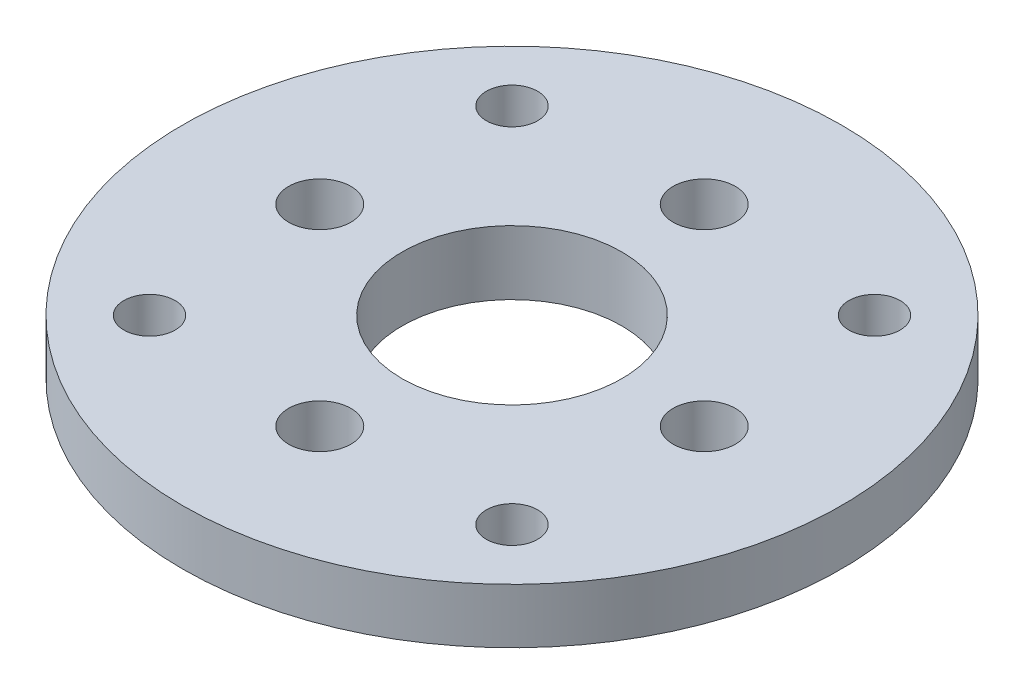
ISO-10303-21;
HEADER;
FILE_DESCRIPTION(('STEP AP214'),'2;1');
FILE_NAME('part.step','',(''),(''),'','','');
FILE_SCHEMA(('AUTOMOTIVE_DESIGN { 1 0 10303 214 1 1 1 1 }'));
ENDSEC;
DATA;
#1=APPLICATION_CONTEXT('core data for automotive mechanical design processes');
#2=APPLICATION_PROTOCOL_DEFINITION('international standard','automotive_design',2000,#1);
#3=PRODUCT_CONTEXT('',#1,'mechanical');
#4=PRODUCT('Part','Part','',(#3));
#5=PRODUCT_RELATED_PRODUCT_CATEGORY('part','',(#4));
#6=PRODUCT_DEFINITION_FORMATION('','',#4);
#7=PRODUCT_DEFINITION_CONTEXT('part definition',#1,'design');
#8=PRODUCT_DEFINITION('design','',#6,#7);
#9=PRODUCT_DEFINITION_SHAPE('','',#8);
#10=(LENGTH_UNIT() NAMED_UNIT(*) SI_UNIT(.MILLI.,.METRE.));
#11=(NAMED_UNIT(*) PLANE_ANGLE_UNIT() SI_UNIT($,.RADIAN.));
#12=(NAMED_UNIT(*) SI_UNIT($,.STERADIAN.) SOLID_ANGLE_UNIT());
#13=UNCERTAINTY_MEASURE_WITH_UNIT(LENGTH_MEASURE(1.E-05),#10,'distance_accuracy_value','');
#14=(GEOMETRIC_REPRESENTATION_CONTEXT(3) GLOBAL_UNCERTAINTY_ASSIGNED_CONTEXT((#13)) GLOBAL_UNIT_ASSIGNED_CONTEXT((#10,
#11,#12)) REPRESENTATION_CONTEXT('',''));
#15=CARTESIAN_POINT('',(0.,0.,0.));
#16=DIRECTION('',(0.,0.,1.));
#17=DIRECTION('',(1.,0.,0.));
#18=AXIS2_PLACEMENT_3D('',#15,#16,#17);
#19=CARTESIAN_POINT('',(0.,0.5,0.));
#20=DIRECTION('',(0.,-1.,0.));
#21=DIRECTION('',(0.,0.,-1.));
#22=AXIS2_PLACEMENT_3D('',#19,#20,#21);
#23=CYLINDRICAL_SURFACE('',#22,16.5);
#24=CARTESIAN_POINT('',(0.,0.5,0.));
#25=DIRECTION('',(0.,1.,0.));
#26=DIRECTION('',(0.,0.,1.));
#27=AXIS2_PLACEMENT_3D('',#24,#25,#26);
#28=CIRCLE('',#27,16.5);
#29=CARTESIAN_POINT('',(0.,0.5,16.5));
#30=VERTEX_POINT('',#29);
#31=EDGE_CURVE('E10',#30,#30,#28,.T.);
#32=ORIENTED_EDGE('',*,*,#31,.F.);
#33=EDGE_LOOP('',(#32));
#34=FACE_BOUND('',#33,.T.);
#35=CARTESIAN_POINT('',(0.,0.,0.));
#36=DIRECTION('',(0.,1.,0.));
#37=DIRECTION('',(0.,0.,1.));
#38=AXIS2_PLACEMENT_3D('',#35,#36,#37);
#39=CIRCLE('',#38,16.5);
#40=CARTESIAN_POINT('',(0.,0.,16.5));
#41=VERTEX_POINT('',#40);
#42=EDGE_CURVE('E39',#41,#41,#39,.T.);
#43=ORIENTED_EDGE('',*,*,#42,.T.);
#44=EDGE_LOOP('',(#43));
#45=FACE_BOUND('',#44,.T.);
#46=ADVANCED_FACE('F38',(#34,#45),#23,.T.);
#47=CARTESIAN_POINT('',(0.,0.,0.));
#48=DIRECTION('',(0.,1.,0.));
#49=DIRECTION('',(0.,0.,1.));
#50=AXIS2_PLACEMENT_3D('',#47,#48,#49);
#51=PLANE('',#50);
#52=CARTESIAN_POINT('',(9.89949493661165,0.,9.89949493661168));
#53=DIRECTION('',(0.,1.,0.));
#54=DIRECTION('',(-1.,0.,0.));
#55=AXIS2_PLACEMENT_3D('',#52,#53,#54);
#56=CIRCLE('',#55,1.4);
#57=CARTESIAN_POINT('',(8.49949493661165,0.,9.89949493661168));
#58=VERTEX_POINT('',#57);
#59=EDGE_CURVE('E105',#58,#58,#56,.T.);
#60=ORIENTED_EDGE('',*,*,#59,.T.);
#61=EDGE_LOOP('',(#60));
#62=FACE_BOUND('',#61,.T.);
#63=CARTESIAN_POINT('',(-9.89949493661165,0.,9.89949493661168));
#64=DIRECTION('',(0.,1.,0.));
#65=DIRECTION('',(0.,0.,-1.));
#66=AXIS2_PLACEMENT_3D('',#63,#64,#65);
#67=CIRCLE('',#66,1.4);
#68=CARTESIAN_POINT('',(-9.89949493661165,0.,8.49949493661168));
#69=VERTEX_POINT('',#68);
#70=EDGE_CURVE('E96',#69,#69,#67,.T.);
#71=ORIENTED_EDGE('',*,*,#70,.T.);
#72=EDGE_LOOP('',(#71));
#73=FACE_BOUND('',#72,.T.);
#74=CARTESIAN_POINT('',(-9.89949493661158,0.,-9.89949493661175));
#75=DIRECTION('',(0.,1.,0.));
#76=DIRECTION('',(1.,0.,0.));
#77=AXIS2_PLACEMENT_3D('',#74,#75,#76);
#78=CIRCLE('',#77,1.4);
#79=CARTESIAN_POINT('',(-8.49949493661158,0.,-9.89949493661174));
#80=VERTEX_POINT('',#79);
#81=EDGE_CURVE('E89',#80,#80,#78,.T.);
#82=ORIENTED_EDGE('',*,*,#81,.T.);
#83=EDGE_LOOP('',(#82));
#84=FACE_BOUND('',#83,.T.);
#85=CARTESIAN_POINT('',(9.89949493661165,0.,-9.89949493661168));
#86=DIRECTION('',(0.,1.,0.));
#87=DIRECTION('',(0.,0.,1.));
#88=AXIS2_PLACEMENT_3D('',#85,#86,#87);
#89=CIRCLE('',#88,1.4);
#90=CARTESIAN_POINT('',(9.89949493661165,0.,-8.49949493661168));
#91=VERTEX_POINT('',#90);
#92=EDGE_CURVE('E83',#91,#91,#89,.T.);
#93=ORIENTED_EDGE('',*,*,#92,.T.);
#94=EDGE_LOOP('',(#93));
#95=FACE_BOUND('',#94,.T.);
#96=CARTESIAN_POINT('',(0.,0.,10.5));
#97=DIRECTION('',(0.,1.,0.));
#98=DIRECTION('',(-1.,0.,0.));
#99=AXIS2_PLACEMENT_3D('',#96,#97,#98);
#100=CIRCLE('',#99,1.7);
#101=CARTESIAN_POINT('',(-1.70000000000004,0.,10.5));
#102=VERTEX_POINT('',#101);
#103=EDGE_CURVE('E78',#102,#102,#100,.T.);
#104=ORIENTED_EDGE('',*,*,#103,.T.);
#105=EDGE_LOOP('',(#104));
#106=FACE_BOUND('',#105,.T.);
#107=CARTESIAN_POINT('',(-10.5,0.,0.));
#108=DIRECTION('',(0.,1.,0.));
#109=DIRECTION('',(0.,0.,-1.));
#110=AXIS2_PLACEMENT_3D('',#107,#108,#109);
#111=CIRCLE('',#110,1.7);
#112=CARTESIAN_POINT('',(-10.5,0.,-1.7));
#113=VERTEX_POINT('',#112);
#114=EDGE_CURVE('E71',#113,#113,#111,.T.);
#115=ORIENTED_EDGE('',*,*,#114,.T.);
#116=EDGE_LOOP('',(#115));
#117=FACE_BOUND('',#116,.T.);
#118=CARTESIAN_POINT('',(1.09981662173559E-13,0.,-10.5));
#119=DIRECTION('',(0.,1.,0.));
#120=DIRECTION('',(1.,0.,0.));
#121=AXIS2_PLACEMENT_3D('',#118,#119,#120);
#122=CIRCLE('',#121,1.7);
#123=CARTESIAN_POINT('',(1.70000000000011,0.,-10.5));
#124=VERTEX_POINT('',#123);
#125=EDGE_CURVE('E68',#124,#124,#122,.T.);
#126=ORIENTED_EDGE('',*,*,#125,.T.);
#127=EDGE_LOOP('',(#126));
#128=FACE_BOUND('',#127,.T.);
#129=CARTESIAN_POINT('',(10.5,0.,0.));
#130=DIRECTION('',(0.,1.,0.));
#131=DIRECTION('',(0.,0.,1.));
#132=AXIS2_PLACEMENT_3D('',#129,#130,#131);
#133=CIRCLE('',#132,1.7);
#134=CARTESIAN_POINT('',(10.5,0.,1.7));
#135=VERTEX_POINT('',#134);
#136=EDGE_CURVE('E58',#135,#135,#133,.T.);
#137=ORIENTED_EDGE('',*,*,#136,.T.);
#138=EDGE_LOOP('',(#137));
#139=FACE_BOUND('',#138,.T.);
#140=CARTESIAN_POINT('',(0.,0.,0.));
#141=DIRECTION('',(0.,1.,0.));
#142=DIRECTION('',(0.,0.,1.));
#143=AXIS2_PLACEMENT_3D('',#140,#141,#142);
#144=CIRCLE('',#143,6.);
#145=CARTESIAN_POINT('',(0.,0.,6.));
#146=VERTEX_POINT('',#145);
#147=EDGE_CURVE('E53',#146,#146,#144,.T.);
#148=ORIENTED_EDGE('',*,*,#147,.T.);
#149=EDGE_LOOP('',(#148));
#150=FACE_BOUND('',#149,.T.);
#151=ORIENTED_EDGE('',*,*,#42,.F.);
#152=EDGE_LOOP('',(#151));
#153=FACE_BOUND('',#152,.T.);
#154=ADVANCED_FACE('F140',(#62,#73,#84,#95,#106,#117,#128,#139,#150,#153),#51,.F.);
#155=CARTESIAN_POINT('',(0.,3.5,0.));
#156=DIRECTION('',(0.,-1.,0.));
#157=DIRECTION('',(0.,0.,-1.));
#158=AXIS2_PLACEMENT_3D('',#155,#156,#157);
#159=CYLINDRICAL_SURFACE('',#158,18.);
#160=CARTESIAN_POINT('',(0.,3.5,0.));
#161=DIRECTION('',(0.,1.,0.));
#162=DIRECTION('',(0.,0.,1.));
#163=AXIS2_PLACEMENT_3D('',#160,#161,#162);
#164=CIRCLE('',#163,18.);
#165=CARTESIAN_POINT('',(0.,3.5,18.));
#166=VERTEX_POINT('',#165);
#167=EDGE_CURVE('E46',#166,#166,#164,.T.);
#168=ORIENTED_EDGE('',*,*,#167,.F.);
#169=EDGE_LOOP('',(#168));
#170=FACE_BOUND('',#169,.T.);
#171=CARTESIAN_POINT('',(0.,0.5,0.));
#172=DIRECTION('',(0.,1.,0.));
#173=DIRECTION('',(0.,0.,1.));
#174=AXIS2_PLACEMENT_3D('',#171,#172,#173);
#175=CIRCLE('',#174,18.);
#176=CARTESIAN_POINT('',(0.,0.5,18.));
#177=VERTEX_POINT('',#176);
#178=EDGE_CURVE('E48',#177,#177,#175,.T.);
#179=ORIENTED_EDGE('',*,*,#178,.T.);
#180=EDGE_LOOP('',(#179));
#181=FACE_BOUND('',#180,.T.);
#182=ADVANCED_FACE('F113',(#170,#181),#159,.T.);
#183=CARTESIAN_POINT('',(0.,3.5,0.));
#184=DIRECTION('',(0.,1.,0.));
#185=DIRECTION('',(0.,0.,1.));
#186=AXIS2_PLACEMENT_3D('',#183,#184,#185);
#187=PLANE('',#186);
#188=CARTESIAN_POINT('',(9.89949493661165,3.5,9.89949493661168));
#189=DIRECTION('',(0.,1.,0.));
#190=DIRECTION('',(-1.,0.,0.));
#191=AXIS2_PLACEMENT_3D('',#188,#189,#190);
#192=CIRCLE('',#191,1.4);
#193=CARTESIAN_POINT('',(8.49949493661165,3.5,9.89949493661168));
#194=VERTEX_POINT('',#193);
#195=EDGE_CURVE('E87',#194,#194,#192,.T.);
#196=ORIENTED_EDGE('',*,*,#195,.F.);
#197=EDGE_LOOP('',(#196));
#198=FACE_BOUND('',#197,.T.);
#199=CARTESIAN_POINT('',(-9.89949493661165,3.5,9.89949493661168));
#200=DIRECTION('',(0.,1.,0.));
#201=DIRECTION('',(0.,0.,-1.));
#202=AXIS2_PLACEMENT_3D('',#199,#200,#201);
#203=CIRCLE('',#202,1.4);
#204=CARTESIAN_POINT('',(-9.89949493661165,3.5,8.49949493661168));
#205=VERTEX_POINT('',#204);
#206=EDGE_CURVE('E97',#205,#205,#203,.T.);
#207=ORIENTED_EDGE('',*,*,#206,.F.);
#208=EDGE_LOOP('',(#207));
#209=FACE_BOUND('',#208,.T.);
#210=CARTESIAN_POINT('',(-9.89949493661158,3.5,-9.89949493661175));
#211=DIRECTION('',(0.,1.,0.));
#212=DIRECTION('',(1.,0.,0.));
#213=AXIS2_PLACEMENT_3D('',#210,#211,#212);
#214=CIRCLE('',#213,1.4);
#215=CARTESIAN_POINT('',(-8.49949493661158,3.5,-9.89949493661174));
#216=VERTEX_POINT('',#215);
#217=EDGE_CURVE('E91',#216,#216,#214,.T.);
#218=ORIENTED_EDGE('',*,*,#217,.F.);
#219=EDGE_LOOP('',(#218));
#220=FACE_BOUND('',#219,.T.);
#221=CARTESIAN_POINT('',(9.89949493661165,3.5,-9.89949493661168));
#222=DIRECTION('',(0.,1.,0.));
#223=DIRECTION('',(0.,0.,1.));
#224=AXIS2_PLACEMENT_3D('',#221,#222,#223);
#225=CIRCLE('',#224,1.4);
#226=CARTESIAN_POINT('',(9.89949493661165,3.5,-8.49949493661168));
#227=VERTEX_POINT('',#226);
#228=EDGE_CURVE('E66',#227,#227,#225,.T.);
#229=ORIENTED_EDGE('',*,*,#228,.F.);
#230=EDGE_LOOP('',(#229));
#231=FACE_BOUND('',#230,.T.);
#232=CARTESIAN_POINT('',(0.,3.5,10.5));
#233=DIRECTION('',(0.,1.,0.));
#234=DIRECTION('',(-1.,0.,0.));
#235=AXIS2_PLACEMENT_3D('',#232,#233,#234);
#236=CIRCLE('',#235,1.7);
#237=CARTESIAN_POINT('',(-1.70000000000004,3.5,10.5));
#238=VERTEX_POINT('',#237);
#239=EDGE_CURVE('E65',#238,#238,#236,.T.);
#240=ORIENTED_EDGE('',*,*,#239,.F.);
#241=EDGE_LOOP('',(#240));
#242=FACE_BOUND('',#241,.T.);
#243=CARTESIAN_POINT('',(-10.5,3.5,0.));
#244=DIRECTION('',(0.,1.,0.));
#245=DIRECTION('',(0.,0.,-1.));
#246=AXIS2_PLACEMENT_3D('',#243,#244,#245);
#247=CIRCLE('',#246,1.7);
#248=CARTESIAN_POINT('',(-10.5,3.5,-1.7));
#249=VERTEX_POINT('',#248);
#250=EDGE_CURVE('E79',#249,#249,#247,.T.);
#251=ORIENTED_EDGE('',*,*,#250,.F.);
#252=EDGE_LOOP('',(#251));
#253=FACE_BOUND('',#252,.T.);
#254=CARTESIAN_POINT('',(1.09981662173559E-13,3.5,-10.5));
#255=DIRECTION('',(0.,1.,0.));
#256=DIRECTION('',(1.,0.,0.));
#257=AXIS2_PLACEMENT_3D('',#254,#255,#256);
#258=CIRCLE('',#257,1.7);
#259=CARTESIAN_POINT('',(1.70000000000011,3.5,-10.5));
#260=VERTEX_POINT('',#259);
#261=EDGE_CURVE('E70',#260,#260,#258,.T.);
#262=ORIENTED_EDGE('',*,*,#261,.F.);
#263=EDGE_LOOP('',(#262));
#264=FACE_BOUND('',#263,.T.);
#265=CARTESIAN_POINT('',(10.5,3.5,0.));
#266=DIRECTION('',(0.,1.,0.));
#267=DIRECTION('',(0.,0.,1.));
#268=AXIS2_PLACEMENT_3D('',#265,#266,#267);
#269=CIRCLE('',#268,1.7);
#270=CARTESIAN_POINT('',(10.5,3.5,1.7));
#271=VERTEX_POINT('',#270);
#272=EDGE_CURVE('E60',#271,#271,#269,.T.);
#273=ORIENTED_EDGE('',*,*,#272,.F.);
#274=EDGE_LOOP('',(#273));
#275=FACE_BOUND('',#274,.T.);
#276=CARTESIAN_POINT('',(0.,3.5,0.));
#277=DIRECTION('',(0.,1.,0.));
#278=DIRECTION('',(0.,0.,1.));
#279=AXIS2_PLACEMENT_3D('',#276,#277,#278);
#280=CIRCLE('',#279,6.);
#281=CARTESIAN_POINT('',(0.,3.5,6.));
#282=VERTEX_POINT('',#281);
#283=EDGE_CURVE('E51',#282,#282,#280,.T.);
#284=ORIENTED_EDGE('',*,*,#283,.F.);
#285=EDGE_LOOP('',(#284));
#286=FACE_BOUND('',#285,.T.);
#287=ORIENTED_EDGE('',*,*,#167,.T.);
#288=EDGE_LOOP('',(#287));
#289=FACE_BOUND('',#288,.T.);
#290=ADVANCED_FACE('F112',(#198,#209,#220,#231,#242,#253,#264,#275,#286,#289),#187,.T.);
#291=CARTESIAN_POINT('',(0.,0.5,0.));
#292=DIRECTION('',(0.,1.,0.));
#293=DIRECTION('',(0.,0.,1.));
#294=AXIS2_PLACEMENT_3D('',#291,#292,#293);
#295=PLANE('',#294);
#296=ORIENTED_EDGE('',*,*,#31,.T.);
#297=EDGE_LOOP('',(#296));
#298=FACE_BOUND('',#297,.T.);
#299=ORIENTED_EDGE('',*,*,#178,.F.);
#300=EDGE_LOOP('',(#299));
#301=FACE_BOUND('',#300,.T.);
#302=ADVANCED_FACE('F111',(#298,#301),#295,.F.);
#303=CARTESIAN_POINT('',(0.,3.5,0.));
#304=DIRECTION('',(0.,-1.,0.));
#305=DIRECTION('',(0.,0.,-1.));
#306=AXIS2_PLACEMENT_3D('',#303,#304,#305);
#307=CYLINDRICAL_SURFACE('',#306,6.);
#308=ORIENTED_EDGE('',*,*,#283,.T.);
#309=EDGE_LOOP('',(#308));
#310=FACE_BOUND('',#309,.T.);
#311=ORIENTED_EDGE('',*,*,#147,.F.);
#312=EDGE_LOOP('',(#311));
#313=FACE_BOUND('',#312,.T.);
#314=ADVANCED_FACE('F142',(#310,#313),#307,.F.);
#315=CARTESIAN_POINT('',(10.5,3.5,0.));
#316=DIRECTION('',(0.,-1.,0.));
#317=DIRECTION('',(0.,0.,-1.));
#318=AXIS2_PLACEMENT_3D('',#315,#316,#317);
#319=CYLINDRICAL_SURFACE('',#318,1.7);
#320=ORIENTED_EDGE('',*,*,#272,.T.);
#321=EDGE_LOOP('',(#320));
#322=FACE_BOUND('',#321,.T.);
#323=ORIENTED_EDGE('',*,*,#136,.F.);
#324=EDGE_LOOP('',(#323));
#325=FACE_BOUND('',#324,.T.);
#326=ADVANCED_FACE('F150',(#322,#325),#319,.F.);
#327=CARTESIAN_POINT('',(1.09981662173559E-13,3.5,-10.5));
#328=DIRECTION('',(0.,-1.,0.));
#329=DIRECTION('',(0.,0.,-1.));
#330=AXIS2_PLACEMENT_3D('',#327,#328,#329);
#331=CYLINDRICAL_SURFACE('',#330,1.7);
#332=ORIENTED_EDGE('',*,*,#261,.T.);
#333=EDGE_LOOP('',(#332));
#334=FACE_BOUND('',#333,.T.);
#335=ORIENTED_EDGE('',*,*,#125,.F.);
#336=EDGE_LOOP('',(#335));
#337=FACE_BOUND('',#336,.T.);
#338=ADVANCED_FACE('F185',(#334,#337),#331,.F.);
#339=CARTESIAN_POINT('',(-10.5,3.5,0.));
#340=DIRECTION('',(0.,-1.,0.));
#341=DIRECTION('',(0.,0.,-1.));
#342=AXIS2_PLACEMENT_3D('',#339,#340,#341);
#343=CYLINDRICAL_SURFACE('',#342,1.7);
#344=ORIENTED_EDGE('',*,*,#250,.T.);
#345=EDGE_LOOP('',(#344));
#346=FACE_BOUND('',#345,.T.);
#347=ORIENTED_EDGE('',*,*,#114,.F.);
#348=EDGE_LOOP('',(#347));
#349=FACE_BOUND('',#348,.T.);
#350=ADVANCED_FACE('F190',(#346,#349),#343,.F.);
#351=CARTESIAN_POINT('',(0.,3.5,10.5));
#352=DIRECTION('',(0.,-1.,0.));
#353=DIRECTION('',(0.,0.,-1.));
#354=AXIS2_PLACEMENT_3D('',#351,#352,#353);
#355=CYLINDRICAL_SURFACE('',#354,1.7);
#356=ORIENTED_EDGE('',*,*,#239,.T.);
#357=EDGE_LOOP('',(#356));
#358=FACE_BOUND('',#357,.T.);
#359=ORIENTED_EDGE('',*,*,#103,.F.);
#360=EDGE_LOOP('',(#359));
#361=FACE_BOUND('',#360,.T.);
#362=ADVANCED_FACE('F193',(#358,#361),#355,.F.);
#363=CARTESIAN_POINT('',(9.89949493661165,3.5,-9.89949493661168));
#364=DIRECTION('',(0.,-1.,0.));
#365=DIRECTION('',(0.,0.,-1.));
#366=AXIS2_PLACEMENT_3D('',#363,#364,#365);
#367=CYLINDRICAL_SURFACE('',#366,1.4);
#368=ORIENTED_EDGE('',*,*,#228,.T.);
#369=EDGE_LOOP('',(#368));
#370=FACE_BOUND('',#369,.T.);
#371=ORIENTED_EDGE('',*,*,#92,.F.);
#372=EDGE_LOOP('',(#371));
#373=FACE_BOUND('',#372,.T.);
#374=ADVANCED_FACE('F196',(#370,#373),#367,.F.);
#375=CARTESIAN_POINT('',(-9.89949493661158,3.5,-9.89949493661175));
#376=DIRECTION('',(0.,-1.,0.));
#377=DIRECTION('',(0.,0.,-1.));
#378=AXIS2_PLACEMENT_3D('',#375,#376,#377);
#379=CYLINDRICAL_SURFACE('',#378,1.4);
#380=ORIENTED_EDGE('',*,*,#217,.T.);
#381=EDGE_LOOP('',(#380));
#382=FACE_BOUND('',#381,.T.);
#383=ORIENTED_EDGE('',*,*,#81,.F.);
#384=EDGE_LOOP('',(#383));
#385=FACE_BOUND('',#384,.T.);
#386=ADVANCED_FACE('F203',(#382,#385),#379,.F.);
#387=CARTESIAN_POINT('',(-9.89949493661165,3.5,9.89949493661168));
#388=DIRECTION('',(0.,-1.,0.));
#389=DIRECTION('',(0.,0.,-1.));
#390=AXIS2_PLACEMENT_3D('',#387,#388,#389);
#391=CYLINDRICAL_SURFACE('',#390,1.4);
#392=ORIENTED_EDGE('',*,*,#206,.T.);
#393=EDGE_LOOP('',(#392));
#394=FACE_BOUND('',#393,.T.);
#395=ORIENTED_EDGE('',*,*,#70,.F.);
#396=EDGE_LOOP('',(#395));
#397=FACE_BOUND('',#396,.T.);
#398=ADVANCED_FACE('F202',(#394,#397),#391,.F.);
#399=CARTESIAN_POINT('',(9.89949493661165,3.5,9.89949493661168));
#400=DIRECTION('',(0.,-1.,0.));
#401=DIRECTION('',(0.,0.,-1.));
#402=AXIS2_PLACEMENT_3D('',#399,#400,#401);
#403=CYLINDRICAL_SURFACE('',#402,1.4);
#404=ORIENTED_EDGE('',*,*,#195,.T.);
#405=EDGE_LOOP('',(#404));
#406=FACE_BOUND('',#405,.T.);
#407=ORIENTED_EDGE('',*,*,#59,.F.);
#408=EDGE_LOOP('',(#407));
#409=FACE_BOUND('',#408,.T.);
#410=ADVANCED_FACE('F107',(#406,#409),#403,.F.);
#411=CLOSED_SHELL('',(#46,#154,#182,#290,#302,#314,#326,#338,#350,#362,#374,#386,#398,#410));
#412=MANIFOLD_SOLID_BREP('B2',#411);
#413=ADVANCED_BREP_SHAPE_REPRESENTATION('',(#18,#412),#14);
#414=SHAPE_DEFINITION_REPRESENTATION(#9,#413);
ENDSEC;
END-ISO-10303-21;
